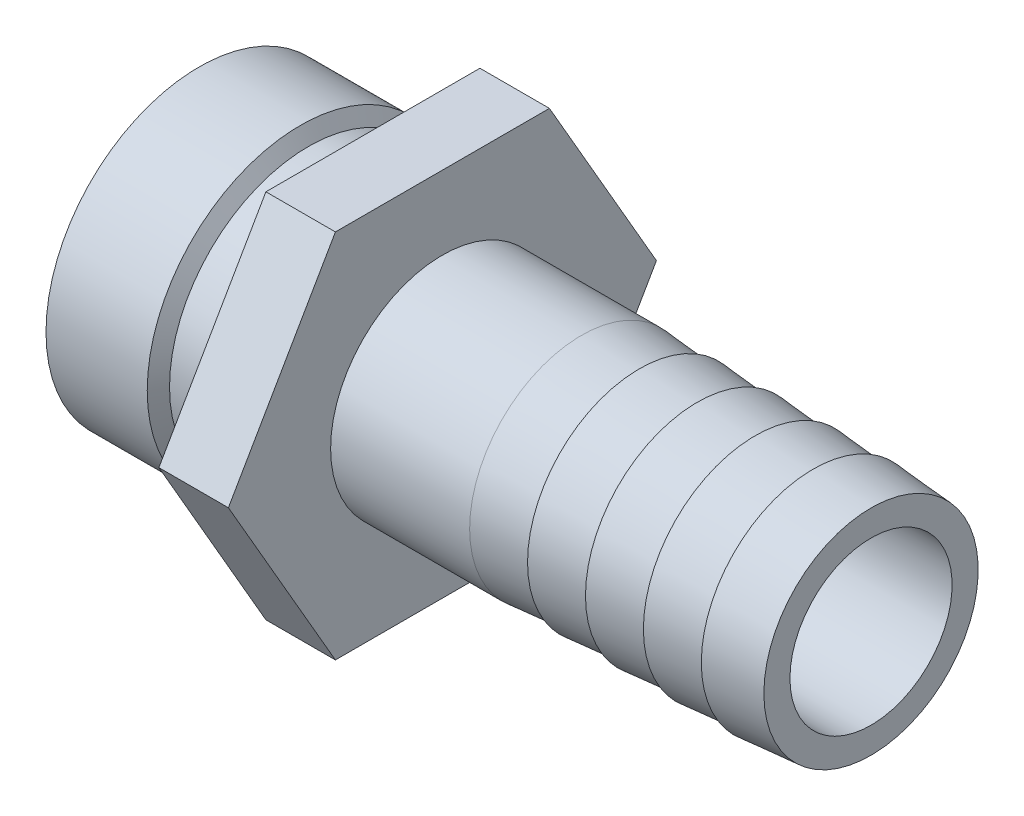
ISO-10303-21;
HEADER;
FILE_DESCRIPTION(('STEP AP214'),'2;1');
FILE_NAME('part.step','',(''),(''),'','','');
FILE_SCHEMA(('AUTOMOTIVE_DESIGN { 1 0 10303 214 1 1 1 1 }'));
ENDSEC;
DATA;
#1=APPLICATION_CONTEXT('core data for automotive mechanical design processes');
#2=APPLICATION_PROTOCOL_DEFINITION('international standard','automotive_design',2000,#1);
#3=PRODUCT_CONTEXT('',#1,'mechanical');
#4=PRODUCT('Part','Part','',(#3));
#5=PRODUCT_RELATED_PRODUCT_CATEGORY('part','',(#4));
#6=PRODUCT_DEFINITION_FORMATION('','',#4);
#7=PRODUCT_DEFINITION_CONTEXT('part definition',#1,'design');
#8=PRODUCT_DEFINITION('design','',#6,#7);
#9=PRODUCT_DEFINITION_SHAPE('','',#8);
#10=(LENGTH_UNIT() NAMED_UNIT(*) SI_UNIT(.MILLI.,.METRE.));
#11=(NAMED_UNIT(*) PLANE_ANGLE_UNIT() SI_UNIT($,.RADIAN.));
#12=(NAMED_UNIT(*) SI_UNIT($,.STERADIAN.) SOLID_ANGLE_UNIT());
#13=UNCERTAINTY_MEASURE_WITH_UNIT(LENGTH_MEASURE(1.E-05),#10,'distance_accuracy_value','');
#14=(GEOMETRIC_REPRESENTATION_CONTEXT(3) GLOBAL_UNCERTAINTY_ASSIGNED_CONTEXT((#13)) GLOBAL_UNIT_ASSIGNED_CONTEXT((#10,
#11,#12)) REPRESENTATION_CONTEXT('',''));
#15=CARTESIAN_POINT('',(0.,0.,0.));
#16=DIRECTION('',(0.,0.,1.));
#17=DIRECTION('',(1.,0.,0.));
#18=AXIS2_PLACEMENT_3D('',#15,#16,#17);
#19=CARTESIAN_POINT('',(-12.8257453814815,0.,0.));
#20=DIRECTION('',(-1.,0.,0.));
#21=DIRECTION('',(0.,0.,1.));
#22=AXIS2_PLACEMENT_3D('',#19,#20,#21);
#23=CYLINDRICAL_SURFACE('',#22,7.);
#24=CARTESIAN_POINT('',(48.,0.,0.));
#25=DIRECTION('',(-1.,0.,0.));
#26=DIRECTION('',(0.,0.,1.));
#27=AXIS2_PLACEMENT_3D('',#24,#25,#26);
#28=CIRCLE('',#27,7.);
#29=CARTESIAN_POINT('',(48.,0.,7.));
#30=VERTEX_POINT('',#29);
#31=EDGE_CURVE('E181',#30,#30,#28,.T.);
#32=ORIENTED_EDGE('',*,*,#31,.F.);
#33=EDGE_LOOP('',(#32));
#34=FACE_BOUND('',#33,.T.);
#35=CARTESIAN_POINT('',(11.,0.,0.));
#36=DIRECTION('',(-1.,0.,0.));
#37=DIRECTION('',(0.,0.,1.));
#38=AXIS2_PLACEMENT_3D('',#35,#36,#37);
#39=CIRCLE('',#38,7.);
#40=CARTESIAN_POINT('',(11.,0.,7.));
#41=VERTEX_POINT('',#40);
#42=EDGE_CURVE('E11',#41,#41,#39,.F.);
#43=ORIENTED_EDGE('',*,*,#42,.F.);
#44=EDGE_LOOP('',(#43));
#45=FACE_BOUND('',#44,.T.);
#46=ADVANCED_FACE('F35',(#34,#45),#23,.F.);
#47=CARTESIAN_POINT('',(-12.8257453814815,0.,0.));
#48=DIRECTION('',(-1.,0.,0.));
#49=DIRECTION('',(0.,0.,1.));
#50=AXIS2_PLACEMENT_3D('',#47,#48,#49);
#51=CYLINDRICAL_SURFACE('',#50,9.65);
#52=CARTESIAN_POINT('',(23.,0.,0.));
#53=DIRECTION('',(-1.,0.,0.));
#54=DIRECTION('',(0.,0.,1.));
#55=AXIS2_PLACEMENT_3D('',#52,#53,#54);
#56=CIRCLE('',#55,9.64999999999999);
#57=CARTESIAN_POINT('',(23.,0.,9.64999999999999));
#58=VERTEX_POINT('',#57);
#59=EDGE_CURVE('E150',#58,#58,#56,.T.);
#60=ORIENTED_EDGE('',*,*,#59,.T.);
#61=EDGE_LOOP('',(#60));
#62=FACE_BOUND('',#61,.T.);
#63=CARTESIAN_POINT('',(11.,0.,0.));
#64=DIRECTION('',(-1.,0.,0.));
#65=DIRECTION('',(0.,0.,1.));
#66=AXIS2_PLACEMENT_3D('',#63,#64,#65);
#67=CIRCLE('',#66,9.65);
#68=CARTESIAN_POINT('',(11.,0.,9.65));
#69=VERTEX_POINT('',#68);
#70=EDGE_CURVE('E45',#69,#69,#67,.T.);
#71=ORIENTED_EDGE('',*,*,#70,.F.);
#72=EDGE_LOOP('',(#71));
#73=FACE_BOUND('',#72,.T.);
#74=ADVANCED_FACE('F192',(#62,#73),#51,.T.);
#75=CARTESIAN_POINT('',(48.,9.24999999999999,0.));
#76=DIRECTION('',(-1.,0.,0.));
#77=DIRECTION('',(0.,0.,1.));
#78=AXIS2_PLACEMENT_3D('',#75,#76,#77);
#79=PLANE('',#78);
#80=CARTESIAN_POINT('',(48.,0.,0.));
#81=DIRECTION('',(-1.,0.,0.));
#82=DIRECTION('',(0.,0.,1.));
#83=AXIS2_PLACEMENT_3D('',#80,#81,#82);
#84=CIRCLE('',#83,9.24999999999999);
#85=CARTESIAN_POINT('',(48.,0.,9.24999999999999));
#86=VERTEX_POINT('',#85);
#87=EDGE_CURVE('E178',#86,#86,#84,.T.);
#88=ORIENTED_EDGE('',*,*,#87,.F.);
#89=EDGE_LOOP('',(#88));
#90=FACE_BOUND('',#89,.T.);
#91=ORIENTED_EDGE('',*,*,#31,.T.);
#92=EDGE_LOOP('',(#91));
#93=FACE_BOUND('',#92,.T.);
#94=ADVANCED_FACE('F194',(#90,#93),#79,.F.);
#95=CARTESIAN_POINT('',(48.,0.,0.));
#96=DIRECTION('',(-1.,0.,0.));
#97=DIRECTION('',(0.,0.,1.));
#98=AXIS2_PLACEMENT_3D('',#95,#96,#97);
#99=CONICAL_SURFACE('',#98,9.24999999999999,0.0798299857122385);
#100=CARTESIAN_POINT('',(43.,0.,0.));
#101=DIRECTION('',(-1.,0.,0.));
#102=DIRECTION('',(0.,0.,1.));
#103=AXIS2_PLACEMENT_3D('',#100,#101,#102);
#104=CIRCLE('',#103,9.65);
#105=CARTESIAN_POINT('',(43.,0.,9.65));
#106=VERTEX_POINT('',#105);
#107=EDGE_CURVE('E175',#106,#106,#104,.T.);
#108=ORIENTED_EDGE('',*,*,#107,.F.);
#109=EDGE_LOOP('',(#108));
#110=FACE_BOUND('',#109,.T.);
#111=ORIENTED_EDGE('',*,*,#87,.T.);
#112=EDGE_LOOP('',(#111));
#113=FACE_BOUND('',#112,.T.);
#114=ADVANCED_FACE('F201',(#110,#113),#99,.T.);
#115=CARTESIAN_POINT('',(43.,9.65,0.));
#116=DIRECTION('',(1.,0.,0.));
#117=DIRECTION('',(0.,0.,-1.));
#118=AXIS2_PLACEMENT_3D('',#115,#116,#117);
#119=PLANE('',#118);
#120=CARTESIAN_POINT('',(43.,0.,0.));
#121=DIRECTION('',(-1.,0.,0.));
#122=DIRECTION('',(0.,0.,1.));
#123=AXIS2_PLACEMENT_3D('',#120,#121,#122);
#124=CIRCLE('',#123,9.24999999999999);
#125=CARTESIAN_POINT('',(43.,0.,9.24999999999999));
#126=VERTEX_POINT('',#125);
#127=EDGE_CURVE('E172',#126,#126,#124,.T.);
#128=ORIENTED_EDGE('',*,*,#127,.F.);
#129=EDGE_LOOP('',(#128));
#130=FACE_BOUND('',#129,.T.);
#131=ORIENTED_EDGE('',*,*,#107,.T.);
#132=EDGE_LOOP('',(#131));
#133=FACE_BOUND('',#132,.T.);
#134=ADVANCED_FACE('F239',(#130,#133),#119,.F.);
#135=CARTESIAN_POINT('',(43.,0.,0.));
#136=DIRECTION('',(-1.,0.,0.));
#137=DIRECTION('',(0.,0.,1.));
#138=AXIS2_PLACEMENT_3D('',#135,#136,#137);
#139=CONICAL_SURFACE('',#138,9.24999999999999,0.0798299857122385);
#140=CARTESIAN_POINT('',(38.,0.,0.));
#141=DIRECTION('',(-1.,0.,0.));
#142=DIRECTION('',(0.,0.,1.));
#143=AXIS2_PLACEMENT_3D('',#140,#141,#142);
#144=CIRCLE('',#143,9.65);
#145=CARTESIAN_POINT('',(38.,0.,9.65));
#146=VERTEX_POINT('',#145);
#147=EDGE_CURVE('E169',#146,#146,#144,.T.);
#148=ORIENTED_EDGE('',*,*,#147,.F.);
#149=EDGE_LOOP('',(#148));
#150=FACE_BOUND('',#149,.T.);
#151=ORIENTED_EDGE('',*,*,#127,.T.);
#152=EDGE_LOOP('',(#151));
#153=FACE_BOUND('',#152,.T.);
#154=ADVANCED_FACE('F235',(#150,#153),#139,.T.);
#155=CARTESIAN_POINT('',(38.,9.65,0.));
#156=DIRECTION('',(1.,0.,0.));
#157=DIRECTION('',(0.,0.,-1.));
#158=AXIS2_PLACEMENT_3D('',#155,#156,#157);
#159=PLANE('',#158);
#160=CARTESIAN_POINT('',(38.,0.,0.));
#161=DIRECTION('',(-1.,0.,0.));
#162=DIRECTION('',(0.,0.,1.));
#163=AXIS2_PLACEMENT_3D('',#160,#161,#162);
#164=CIRCLE('',#163,9.24999999999999);
#165=CARTESIAN_POINT('',(38.,0.,9.24999999999999));
#166=VERTEX_POINT('',#165);
#167=EDGE_CURVE('E166',#166,#166,#164,.T.);
#168=ORIENTED_EDGE('',*,*,#167,.F.);
#169=EDGE_LOOP('',(#168));
#170=FACE_BOUND('',#169,.T.);
#171=ORIENTED_EDGE('',*,*,#147,.T.);
#172=EDGE_LOOP('',(#171));
#173=FACE_BOUND('',#172,.T.);
#174=ADVANCED_FACE('F231',(#170,#173),#159,.F.);
#175=CARTESIAN_POINT('',(38.,0.,0.));
#176=DIRECTION('',(-1.,0.,0.));
#177=DIRECTION('',(0.,0.,1.));
#178=AXIS2_PLACEMENT_3D('',#175,#176,#177);
#179=CONICAL_SURFACE('',#178,9.24999999999999,0.0798299857122385);
#180=CARTESIAN_POINT('',(33.,0.,0.));
#181=DIRECTION('',(-1.,0.,0.));
#182=DIRECTION('',(0.,0.,1.));
#183=AXIS2_PLACEMENT_3D('',#180,#181,#182);
#184=CIRCLE('',#183,9.65);
#185=CARTESIAN_POINT('',(33.,0.,9.65));
#186=VERTEX_POINT('',#185);
#187=EDGE_CURVE('E163',#186,#186,#184,.T.);
#188=ORIENTED_EDGE('',*,*,#187,.F.);
#189=EDGE_LOOP('',(#188));
#190=FACE_BOUND('',#189,.T.);
#191=ORIENTED_EDGE('',*,*,#167,.T.);
#192=EDGE_LOOP('',(#191));
#193=FACE_BOUND('',#192,.T.);
#194=ADVANCED_FACE('F227',(#190,#193),#179,.T.);
#195=CARTESIAN_POINT('',(33.,9.65,0.));
#196=DIRECTION('',(1.,0.,0.));
#197=DIRECTION('',(0.,0.,-1.));
#198=AXIS2_PLACEMENT_3D('',#195,#196,#197);
#199=PLANE('',#198);
#200=CARTESIAN_POINT('',(33.,0.,0.));
#201=DIRECTION('',(-1.,0.,0.));
#202=DIRECTION('',(0.,0.,1.));
#203=AXIS2_PLACEMENT_3D('',#200,#201,#202);
#204=CIRCLE('',#203,9.24999999999999);
#205=CARTESIAN_POINT('',(33.,0.,9.24999999999999));
#206=VERTEX_POINT('',#205);
#207=EDGE_CURVE('E160',#206,#206,#204,.T.);
#208=ORIENTED_EDGE('',*,*,#207,.F.);
#209=EDGE_LOOP('',(#208));
#210=FACE_BOUND('',#209,.T.);
#211=ORIENTED_EDGE('',*,*,#187,.T.);
#212=EDGE_LOOP('',(#211));
#213=FACE_BOUND('',#212,.T.);
#214=ADVANCED_FACE('F223',(#210,#213),#199,.F.);
#215=CARTESIAN_POINT('',(33.,0.,0.));
#216=DIRECTION('',(-1.,0.,0.));
#217=DIRECTION('',(0.,0.,1.));
#218=AXIS2_PLACEMENT_3D('',#215,#216,#217);
#219=CONICAL_SURFACE('',#218,9.24999999999999,0.0798299857122386);
#220=CARTESIAN_POINT('',(28.,0.,0.));
#221=DIRECTION('',(-1.,0.,0.));
#222=DIRECTION('',(0.,0.,1.));
#223=AXIS2_PLACEMENT_3D('',#220,#221,#222);
#224=CIRCLE('',#223,9.65);
#225=CARTESIAN_POINT('',(28.,0.,9.65));
#226=VERTEX_POINT('',#225);
#227=EDGE_CURVE('E157',#226,#226,#224,.T.);
#228=ORIENTED_EDGE('',*,*,#227,.F.);
#229=EDGE_LOOP('',(#228));
#230=FACE_BOUND('',#229,.T.);
#231=ORIENTED_EDGE('',*,*,#207,.T.);
#232=EDGE_LOOP('',(#231));
#233=FACE_BOUND('',#232,.T.);
#234=ADVANCED_FACE('F219',(#230,#233),#219,.T.);
#235=CARTESIAN_POINT('',(28.,9.65,0.));
#236=DIRECTION('',(1.,0.,0.));
#237=DIRECTION('',(0.,0.,-1.));
#238=AXIS2_PLACEMENT_3D('',#235,#236,#237);
#239=PLANE('',#238);
#240=CARTESIAN_POINT('',(28.,0.,0.));
#241=DIRECTION('',(-1.,0.,0.));
#242=DIRECTION('',(0.,0.,1.));
#243=AXIS2_PLACEMENT_3D('',#240,#241,#242);
#244=CIRCLE('',#243,9.24999999999999);
#245=CARTESIAN_POINT('',(28.,0.,9.24999999999999));
#246=VERTEX_POINT('',#245);
#247=EDGE_CURVE('E154',#246,#246,#244,.T.);
#248=ORIENTED_EDGE('',*,*,#247,.F.);
#249=EDGE_LOOP('',(#248));
#250=FACE_BOUND('',#249,.T.);
#251=ORIENTED_EDGE('',*,*,#227,.T.);
#252=EDGE_LOOP('',(#251));
#253=FACE_BOUND('',#252,.T.);
#254=ADVANCED_FACE('F215',(#250,#253),#239,.F.);
#255=CARTESIAN_POINT('',(28.,0.,0.));
#256=DIRECTION('',(-1.,0.,0.));
#257=DIRECTION('',(0.,0.,1.));
#258=AXIS2_PLACEMENT_3D('',#255,#256,#257);
#259=CONICAL_SURFACE('',#258,9.24999999999999,0.0798299857122385);
#260=ORIENTED_EDGE('',*,*,#59,.F.);
#261=EDGE_LOOP('',(#260));
#262=FACE_BOUND('',#261,.T.);
#263=ORIENTED_EDGE('',*,*,#247,.T.);
#264=EDGE_LOOP('',(#263));
#265=FACE_BOUND('',#264,.T.);
#266=ADVANCED_FACE('F211',(#262,#265),#259,.T.);
#267=CARTESIAN_POINT('',(11.,-16.,9.23760430703402));
#268=DIRECTION('',(0.,-0.5,0.866025403784438));
#269=DIRECTION('',(0.,-0.866025403784439,-0.5));
#270=AXIS2_PLACEMENT_3D('',#267,#268,#269);
#271=PLANE('',#270);
#272=DIRECTION('',(0.,0.866025403784439,0.5));
#273=VECTOR('',#272,1.);
#274=CARTESIAN_POINT('',(5.,-16.,9.23760430703402));
#275=LINE('',#274,#273);
#276=CARTESIAN_POINT('',(5.,-16.,9.23760430703402));
#277=VERTEX_POINT('',#276);
#278=CARTESIAN_POINT('',(5.,0.,18.475208614068));
#279=VERTEX_POINT('',#278);
#280=EDGE_CURVE('E129',#277,#279,#275,.T.);
#281=ORIENTED_EDGE('',*,*,#280,.F.);
#282=DIRECTION('',(-1.,0.,0.));
#283=VECTOR('',#282,1.);
#284=CARTESIAN_POINT('',(11.,-16.,9.23760430703402));
#285=LINE('',#284,#283);
#286=CARTESIAN_POINT('',(11.,-16.,9.23760430703402));
#287=VERTEX_POINT('',#286);
#288=EDGE_CURVE('E89',#287,#277,#285,.T.);
#289=ORIENTED_EDGE('',*,*,#288,.F.);
#290=DIRECTION('',(0.,0.866025403784439,0.5));
#291=VECTOR('',#290,1.);
#292=CARTESIAN_POINT('',(11.,-16.,9.23760430703402));
#293=LINE('',#292,#291);
#294=CARTESIAN_POINT('',(11.,0.,18.475208614068));
#295=VERTEX_POINT('',#294);
#296=EDGE_CURVE('E121',#287,#295,#293,.T.);
#297=ORIENTED_EDGE('',*,*,#296,.T.);
#298=DIRECTION('',(-1.,0.,0.));
#299=VECTOR('',#298,1.);
#300=CARTESIAN_POINT('',(11.,0.,18.475208614068));
#301=LINE('',#300,#299);
#302=EDGE_CURVE('E146',#295,#279,#301,.T.);
#303=ORIENTED_EDGE('',*,*,#302,.T.);
#304=EDGE_LOOP('',(#281,#289,#297,#303));
#305=FACE_BOUND('',#304,.T.);
#306=ADVANCED_FACE('F214',(#305),#271,.T.);
#307=CARTESIAN_POINT('',(11.,0.,18.475208614068));
#308=DIRECTION('',(0.,0.5,0.866025403784438));
#309=DIRECTION('',(0.,-0.866025403784439,0.5));
#310=AXIS2_PLACEMENT_3D('',#307,#308,#309);
#311=PLANE('',#310);
#312=DIRECTION('',(0.,0.866025403784439,-0.5));
#313=VECTOR('',#312,1.);
#314=CARTESIAN_POINT('',(5.,0.,18.475208614068));
#315=LINE('',#314,#313);
#316=CARTESIAN_POINT('',(5.,16.,9.23760430703402));
#317=VERTEX_POINT('',#316);
#318=EDGE_CURVE('E132',#279,#317,#315,.T.);
#319=ORIENTED_EDGE('',*,*,#318,.F.);
#320=ORIENTED_EDGE('',*,*,#302,.F.);
#321=DIRECTION('',(0.,0.866025403784439,-0.5));
#322=VECTOR('',#321,1.);
#323=CARTESIAN_POINT('',(11.,0.,18.475208614068));
#324=LINE('',#323,#322);
#325=CARTESIAN_POINT('',(11.,16.,9.23760430703402));
#326=VERTEX_POINT('',#325);
#327=EDGE_CURVE('E119',#295,#326,#324,.T.);
#328=ORIENTED_EDGE('',*,*,#327,.T.);
#329=DIRECTION('',(-1.,0.,0.));
#330=VECTOR('',#329,1.);
#331=CARTESIAN_POINT('',(11.,16.,9.23760430703402));
#332=LINE('',#331,#330);
#333=EDGE_CURVE('E107',#326,#317,#332,.T.);
#334=ORIENTED_EDGE('',*,*,#333,.T.);
#335=EDGE_LOOP('',(#319,#320,#328,#334));
#336=FACE_BOUND('',#335,.T.);
#337=ADVANCED_FACE('F288',(#336),#311,.T.);
#338=CARTESIAN_POINT('',(11.,16.,9.23760430703402));
#339=DIRECTION('',(0.,1.,0.));
#340=DIRECTION('',(0.,0.,1.));
#341=AXIS2_PLACEMENT_3D('',#338,#339,#340);
#342=PLANE('',#341);
#343=DIRECTION('',(0.,0.,-1.));
#344=VECTOR('',#343,1.);
#345=CARTESIAN_POINT('',(5.,16.,9.23760430703402));
#346=LINE('',#345,#344);
#347=CARTESIAN_POINT('',(5.,16.,-9.23760430703401));
#348=VERTEX_POINT('',#347);
#349=EDGE_CURVE('E135',#317,#348,#346,.T.);
#350=ORIENTED_EDGE('',*,*,#349,.F.);
#351=ORIENTED_EDGE('',*,*,#333,.F.);
#352=DIRECTION('',(0.,0.,-1.));
#353=VECTOR('',#352,1.);
#354=CARTESIAN_POINT('',(11.,16.,9.23760430703402));
#355=LINE('',#354,#353);
#356=CARTESIAN_POINT('',(11.,16.,-9.23760430703401));
#357=VERTEX_POINT('',#356);
#358=EDGE_CURVE('E114',#326,#357,#355,.T.);
#359=ORIENTED_EDGE('',*,*,#358,.T.);
#360=DIRECTION('',(-1.,0.,0.));
#361=VECTOR('',#360,1.);
#362=CARTESIAN_POINT('',(11.,16.,-9.23760430703401));
#363=LINE('',#362,#361);
#364=EDGE_CURVE('E97',#357,#348,#363,.T.);
#365=ORIENTED_EDGE('',*,*,#364,.T.);
#366=EDGE_LOOP('',(#350,#351,#359,#365));
#367=FACE_BOUND('',#366,.T.);
#368=ADVANCED_FACE('F118',(#367),#342,.T.);
#369=CARTESIAN_POINT('',(11.,16.,-9.23760430703401));
#370=DIRECTION('',(0.,0.5,-0.866025403784438));
#371=DIRECTION('',(0.,0.866025403784439,0.5));
#372=AXIS2_PLACEMENT_3D('',#369,#370,#371);
#373=PLANE('',#372);
#374=DIRECTION('',(0.,-0.866025403784439,-0.5));
#375=VECTOR('',#374,1.);
#376=CARTESIAN_POINT('',(5.,16.,-9.23760430703401));
#377=LINE('',#376,#375);
#378=CARTESIAN_POINT('',(5.,0.,-18.475208614068));
#379=VERTEX_POINT('',#378);
#380=EDGE_CURVE('E102',#348,#379,#377,.T.);
#381=ORIENTED_EDGE('',*,*,#380,.F.);
#382=ORIENTED_EDGE('',*,*,#364,.F.);
#383=DIRECTION('',(0.,-0.866025403784439,-0.5));
#384=VECTOR('',#383,1.);
#385=CARTESIAN_POINT('',(11.,16.,-9.23760430703401));
#386=LINE('',#385,#384);
#387=CARTESIAN_POINT('',(11.,0.,-18.475208614068));
#388=VERTEX_POINT('',#387);
#389=EDGE_CURVE('E100',#357,#388,#386,.T.);
#390=ORIENTED_EDGE('',*,*,#389,.T.);
#391=DIRECTION('',(-1.,0.,0.));
#392=VECTOR('',#391,1.);
#393=CARTESIAN_POINT('',(11.,0.,-18.475208614068));
#394=LINE('',#393,#392);
#395=EDGE_CURVE('E77',#388,#379,#394,.T.);
#396=ORIENTED_EDGE('',*,*,#395,.T.);
#397=EDGE_LOOP('',(#381,#382,#390,#396));
#398=FACE_BOUND('',#397,.T.);
#399=ADVANCED_FACE('F99',(#398),#373,.T.);
#400=CARTESIAN_POINT('',(11.,0.,-18.475208614068));
#401=DIRECTION('',(0.,-0.5,-0.866025403784439));
#402=DIRECTION('',(0.,0.866025403784439,-0.5));
#403=AXIS2_PLACEMENT_3D('',#400,#401,#402);
#404=PLANE('',#403);
#405=DIRECTION('',(0.,-0.866025403784438,0.5));
#406=VECTOR('',#405,1.);
#407=CARTESIAN_POINT('',(5.,0.,-18.475208614068));
#408=LINE('',#407,#406);
#409=CARTESIAN_POINT('',(5.,-16.,-9.237604307034));
#410=VERTEX_POINT('',#409);
#411=EDGE_CURVE('E138',#379,#410,#408,.T.);
#412=ORIENTED_EDGE('',*,*,#411,.F.);
#413=ORIENTED_EDGE('',*,*,#395,.F.);
#414=DIRECTION('',(0.,-0.866025403784438,0.5));
#415=VECTOR('',#414,1.);
#416=CARTESIAN_POINT('',(11.,0.,-18.475208614068));
#417=LINE('',#416,#415);
#418=CARTESIAN_POINT('',(11.,-16.,-9.237604307034));
#419=VERTEX_POINT('',#418);
#420=EDGE_CURVE('E116',#388,#419,#417,.T.);
#421=ORIENTED_EDGE('',*,*,#420,.T.);
#422=DIRECTION('',(-1.,0.,0.));
#423=VECTOR('',#422,1.);
#424=CARTESIAN_POINT('',(11.,-16.,-9.237604307034));
#425=LINE('',#424,#423);
#426=EDGE_CURVE('E54',#419,#410,#425,.T.);
#427=ORIENTED_EDGE('',*,*,#426,.T.);
#428=EDGE_LOOP('',(#412,#413,#421,#427));
#429=FACE_BOUND('',#428,.T.);
#430=ADVANCED_FACE('F275',(#429),#404,.T.);
#431=CARTESIAN_POINT('',(11.,-16.,-9.237604307034));
#432=DIRECTION('',(0.,-1.,0.));
#433=DIRECTION('',(0.,0.,-1.));
#434=AXIS2_PLACEMENT_3D('',#431,#432,#433);
#435=PLANE('',#434);
#436=DIRECTION('',(0.,0.,1.));
#437=VECTOR('',#436,1.);
#438=CARTESIAN_POINT('',(5.,-16.,-9.237604307034));
#439=LINE('',#438,#437);
#440=EDGE_CURVE('E126',#410,#277,#439,.T.);
#441=ORIENTED_EDGE('',*,*,#440,.F.);
#442=ORIENTED_EDGE('',*,*,#426,.F.);
#443=DIRECTION('',(0.,0.,1.));
#444=VECTOR('',#443,1.);
#445=CARTESIAN_POINT('',(11.,-16.,-9.237604307034));
#446=LINE('',#445,#444);
#447=EDGE_CURVE('E141',#419,#287,#446,.T.);
#448=ORIENTED_EDGE('',*,*,#447,.T.);
#449=ORIENTED_EDGE('',*,*,#288,.T.);
#450=EDGE_LOOP('',(#441,#442,#448,#449));
#451=FACE_BOUND('',#450,.T.);
#452=ADVANCED_FACE('F209',(#451),#435,.T.);
#453=CARTESIAN_POINT('',(5.,-16.,9.23760430703402));
#454=DIRECTION('',(-1.,0.,0.));
#455=DIRECTION('',(0.,0.,1.));
#456=AXIS2_PLACEMENT_3D('',#453,#454,#455);
#457=PLANE('',#456);
#458=CARTESIAN_POINT('',(5.,0.,0.));
#459=DIRECTION('',(-1.,0.,0.));
#460=DIRECTION('',(0.,0.,1.));
#461=AXIS2_PLACEMENT_3D('',#458,#459,#460);
#462=CIRCLE('',#461,12.);
#463=CARTESIAN_POINT('',(5.,0.,12.));
#464=VERTEX_POINT('',#463);
#465=EDGE_CURVE('E263',#464,#464,#462,.T.);
#466=ORIENTED_EDGE('',*,*,#465,.F.);
#467=EDGE_LOOP('',(#466));
#468=FACE_BOUND('',#467,.T.);
#469=ORIENTED_EDGE('',*,*,#440,.T.);
#470=ORIENTED_EDGE('',*,*,#280,.T.);
#471=ORIENTED_EDGE('',*,*,#318,.T.);
#472=ORIENTED_EDGE('',*,*,#349,.T.);
#473=ORIENTED_EDGE('',*,*,#380,.T.);
#474=ORIENTED_EDGE('',*,*,#411,.T.);
#475=EDGE_LOOP('',(#469,#470,#471,#472,#473,#474));
#476=FACE_BOUND('',#475,.T.);
#477=ADVANCED_FACE('F274',(#468,#476),#457,.T.);
#478=CARTESIAN_POINT('',(11.,-16.,9.23760430703402));
#479=DIRECTION('',(-1.,0.,0.));
#480=DIRECTION('',(0.,0.,1.));
#481=AXIS2_PLACEMENT_3D('',#478,#479,#480);
#482=PLANE('',#481);
#483=ORIENTED_EDGE('',*,*,#447,.F.);
#484=ORIENTED_EDGE('',*,*,#420,.F.);
#485=ORIENTED_EDGE('',*,*,#389,.F.);
#486=ORIENTED_EDGE('',*,*,#358,.F.);
#487=ORIENTED_EDGE('',*,*,#327,.F.);
#488=ORIENTED_EDGE('',*,*,#296,.F.);
#489=EDGE_LOOP('',(#483,#484,#485,#486,#487,#488));
#490=FACE_BOUND('',#489,.T.);
#491=ORIENTED_EDGE('',*,*,#70,.T.);
#492=EDGE_LOOP('',(#491));
#493=FACE_BOUND('',#492,.T.);
#494=ADVANCED_FACE('F111',(#490,#493),#482,.F.);
#495=ORIENTED_EDGE('',*,*,#42,.T.);
#496=EDGE_LOOP('',(#495));
#497=FACE_BOUND('',#496,.T.);
#498=ADVANCED_FACE('F329',(#497),#482,.F.);
#499=CARTESIAN_POINT('',(-2.,0.,0.));
#500=DIRECTION('',(-1.,0.,0.));
#501=DIRECTION('',(0.,0.,1.));
#502=AXIS2_PLACEMENT_3D('',#499,#500,#501);
#503=CONICAL_SURFACE('',#502,14.5,1.0471975511966);
#504=CARTESIAN_POINT('',(-0.556624327025943,0.,0.));
#505=DIRECTION('',(-1.,0.,0.));
#506=DIRECTION('',(0.,0.,1.));
#507=AXIS2_PLACEMENT_3D('',#504,#505,#506);
#508=CIRCLE('',#507,12.);
#509=CARTESIAN_POINT('',(-0.556624327025943,0.,12.));
#510=VERTEX_POINT('',#509);
#511=EDGE_CURVE('E265',#510,#510,#508,.T.);
#512=ORIENTED_EDGE('',*,*,#511,.T.);
#513=EDGE_LOOP('',(#512));
#514=FACE_BOUND('',#513,.T.);
#515=CARTESIAN_POINT('',(-1.26099165543728,0.,0.));
#516=DIRECTION('',(-1.,0.,0.));
#517=DIRECTION('',(0.,0.,1.));
#518=AXIS2_PLACEMENT_3D('',#515,#516,#517);
#519=CIRCLE('',#518,13.22);
#520=CARTESIAN_POINT('',(-1.26099165543728,0.,13.22));
#521=VERTEX_POINT('',#520);
#522=EDGE_CURVE('E39',#521,#521,#519,.F.);
#523=ORIENTED_EDGE('',*,*,#522,.T.);
#524=EDGE_LOOP('',(#523));
#525=FACE_BOUND('',#524,.T.);
#526=ADVANCED_FACE('F355',(#514,#525),#503,.T.);
#527=CARTESIAN_POINT('',(-12.8257453814815,0.,0.));
#528=DIRECTION('',(-1.,0.,0.));
#529=DIRECTION('',(0.,0.,1.));
#530=AXIS2_PLACEMENT_3D('',#527,#528,#529);
#531=CYLINDRICAL_SURFACE('',#530,12.);
#532=ORIENTED_EDGE('',*,*,#465,.T.);
#533=EDGE_LOOP('',(#532));
#534=FACE_BOUND('',#533,.T.);
#535=ORIENTED_EDGE('',*,*,#511,.F.);
#536=EDGE_LOOP('',(#535));
#537=FACE_BOUND('',#536,.T.);
#538=ADVANCED_FACE('F346',(#534,#537),#531,.T.);
#539=CARTESIAN_POINT('',(5.,0.,0.));
#540=DIRECTION('',(-1.,0.,0.));
#541=DIRECTION('',(0.,0.,1.));
#542=AXIS2_PLACEMENT_3D('',#539,#540,#541);
#543=CIRCLE('',#542,7.);
#544=CARTESIAN_POINT('',(5.,0.,7.));
#545=VERTEX_POINT('',#544);
#546=EDGE_CURVE('E143',#545,#545,#543,.F.);
#547=ORIENTED_EDGE('',*,*,#546,.F.);
#548=EDGE_LOOP('',(#547));
#549=FACE_BOUND('',#548,.T.);
#550=ADVANCED_FACE('F248',(#549),#457,.T.);
#551=ORIENTED_EDGE('',*,*,#546,.T.);
#552=EDGE_LOOP('',(#551));
#553=FACE_BOUND('',#552,.T.);
#554=CARTESIAN_POINT('',(-10.,0.,0.));
#555=DIRECTION('',(-1.,0.,0.));
#556=DIRECTION('',(0.,0.,1.));
#557=AXIS2_PLACEMENT_3D('',#554,#555,#556);
#558=CIRCLE('',#557,6.99999999999999);
#559=CARTESIAN_POINT('',(-10.,0.,6.99999999999999));
#560=VERTEX_POINT('',#559);
#561=EDGE_CURVE('E184',#560,#560,#558,.T.);
#562=ORIENTED_EDGE('',*,*,#561,.T.);
#563=EDGE_LOOP('',(#562));
#564=FACE_BOUND('',#563,.T.);
#565=ADVANCED_FACE('F206',(#553,#564),#23,.F.);
#566=CARTESIAN_POINT('',(-10.,13.22,0.));
#567=DIRECTION('',(1.,0.,0.));
#568=DIRECTION('',(0.,0.,-1.));
#569=AXIS2_PLACEMENT_3D('',#566,#567,#568);
#570=PLANE('',#569);
#571=ORIENTED_EDGE('',*,*,#561,.F.);
#572=EDGE_LOOP('',(#571));
#573=FACE_BOUND('',#572,.T.);
#574=CARTESIAN_POINT('',(-10.,0.,0.));
#575=DIRECTION('',(-1.,0.,0.));
#576=DIRECTION('',(0.,0.,1.));
#577=AXIS2_PLACEMENT_3D('',#574,#575,#576);
#578=CIRCLE('',#577,13.22);
#579=CARTESIAN_POINT('',(-10.,0.,13.22));
#580=VERTEX_POINT('',#579);
#581=EDGE_CURVE('E187',#580,#580,#578,.T.);
#582=ORIENTED_EDGE('',*,*,#581,.T.);
#583=EDGE_LOOP('',(#582));
#584=FACE_BOUND('',#583,.T.);
#585=ADVANCED_FACE('F247',(#573,#584),#570,.F.);
#586=CARTESIAN_POINT('',(-12.8257453814815,0.,0.));
#587=DIRECTION('',(-1.,0.,0.));
#588=DIRECTION('',(0.,0.,1.));
#589=AXIS2_PLACEMENT_3D('',#586,#587,#588);
#590=CYLINDRICAL_SURFACE('',#589,13.22);
#591=ORIENTED_EDGE('',*,*,#581,.F.);
#592=EDGE_LOOP('',(#591));
#593=FACE_BOUND('',#592,.T.);
#594=ORIENTED_EDGE('',*,*,#522,.F.);
#595=EDGE_LOOP('',(#594));
#596=FACE_BOUND('',#595,.T.);
#597=ADVANCED_FACE('F37',(#593,#596),#590,.T.);
#598=CLOSED_SHELL('',(#46,#74,#94,#114,#134,#154,#174,#194,#214,#234,#254,#266,#306,#337,#368,
#399,#430,#452,#477,#494,#498,#526,#538,#550,#565,#585,#597));
#599=MANIFOLD_SOLID_BREP('B2',#598);
#600=ADVANCED_BREP_SHAPE_REPRESENTATION('',(#18,#599),#14);
#601=SHAPE_DEFINITION_REPRESENTATION(#9,#600);
ENDSEC;
END-ISO-10303-21;
